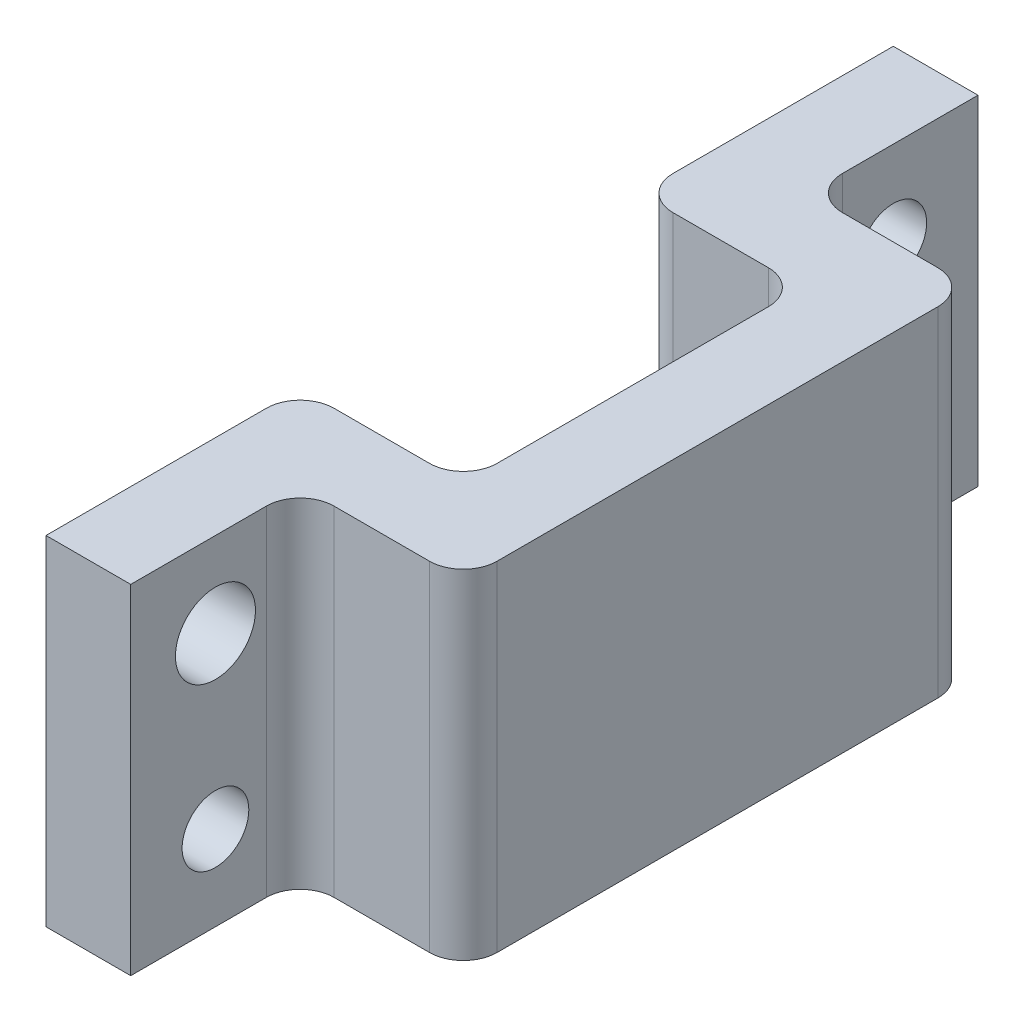
ISO-10303-21;
HEADER;
FILE_DESCRIPTION(('STEP AP214'),'2;1');
FILE_NAME('part.step','',(''),(''),'','','');
FILE_SCHEMA(('AUTOMOTIVE_DESIGN { 1 0 10303 214 1 1 1 1 }'));
ENDSEC;
DATA;
#1=APPLICATION_CONTEXT('core data for automotive mechanical design processes');
#2=APPLICATION_PROTOCOL_DEFINITION('international standard','automotive_design',2000,#1);
#3=PRODUCT_CONTEXT('',#1,'mechanical');
#4=PRODUCT('Part','Part','',(#3));
#5=PRODUCT_RELATED_PRODUCT_CATEGORY('part','',(#4));
#6=PRODUCT_DEFINITION_FORMATION('','',#4);
#7=PRODUCT_DEFINITION_CONTEXT('part definition',#1,'design');
#8=PRODUCT_DEFINITION('design','',#6,#7);
#9=PRODUCT_DEFINITION_SHAPE('','',#8);
#10=(LENGTH_UNIT() NAMED_UNIT(*) SI_UNIT(.MILLI.,.METRE.));
#11=(NAMED_UNIT(*) PLANE_ANGLE_UNIT() SI_UNIT($,.RADIAN.));
#12=(NAMED_UNIT(*) SI_UNIT($,.STERADIAN.) SOLID_ANGLE_UNIT());
#13=UNCERTAINTY_MEASURE_WITH_UNIT(LENGTH_MEASURE(1.E-05),#10,'distance_accuracy_value','');
#14=(GEOMETRIC_REPRESENTATION_CONTEXT(3) GLOBAL_UNCERTAINTY_ASSIGNED_CONTEXT((#13)) GLOBAL_UNIT_ASSIGNED_CONTEXT((#10,
#11,#12)) REPRESENTATION_CONTEXT('',''));
#15=CARTESIAN_POINT('',(0.,0.,0.));
#16=DIRECTION('',(0.,0.,1.));
#17=DIRECTION('',(1.,0.,0.));
#18=AXIS2_PLACEMENT_3D('',#15,#16,#17);
#19=CARTESIAN_POINT('',(0.476250000000005,25.4,-31.75));
#20=DIRECTION('',(0.,0.,1.));
#21=DIRECTION('',(1.,0.,0.));
#22=AXIS2_PLACEMENT_3D('',#19,#20,#21);
#23=PLANE('',#22);
#24=DIRECTION('',(-1.,0.,0.));
#25=VECTOR('',#24,1.);
#26=CARTESIAN_POINT('',(0.476250000000005,0.,-31.75));
#27=LINE('',#26,#25);
#28=CARTESIAN_POINT('',(6.82625,0.,-31.75));
#29=VERTEX_POINT('',#28);
#30=CARTESIAN_POINT('',(0.476250000000005,0.,-31.75));
#31=VERTEX_POINT('',#30);
#32=EDGE_CURVE('E215',#29,#31,#27,.T.);
#33=ORIENTED_EDGE('',*,*,#32,.T.);
#34=DIRECTION('',(0.,-1.,0.));
#35=VECTOR('',#34,1.);
#36=CARTESIAN_POINT('',(0.476250000000005,25.4,-31.75));
#37=LINE('',#36,#35);
#38=CARTESIAN_POINT('',(0.476250000000005,25.4,-31.75));
#39=VERTEX_POINT('',#38);
#40=EDGE_CURVE('E11',#39,#31,#37,.T.);
#41=ORIENTED_EDGE('',*,*,#40,.F.);
#42=DIRECTION('',(-1.,0.,0.));
#43=VECTOR('',#42,1.);
#44=CARTESIAN_POINT('',(0.476250000000005,25.4,-31.75));
#45=LINE('',#44,#43);
#46=CARTESIAN_POINT('',(6.82625,25.4,-31.75));
#47=VERTEX_POINT('',#46);
#48=EDGE_CURVE('E254',#47,#39,#45,.T.);
#49=ORIENTED_EDGE('',*,*,#48,.F.);
#50=DIRECTION('',(0.,-1.,0.));
#51=VECTOR('',#50,1.);
#52=CARTESIAN_POINT('',(6.82625,25.4,-31.75));
#53=LINE('',#52,#51);
#54=EDGE_CURVE('E211',#47,#29,#53,.T.);
#55=ORIENTED_EDGE('',*,*,#54,.T.);
#56=EDGE_LOOP('',(#33,#41,#49,#55));
#57=FACE_BOUND('',#56,.T.);
#58=ADVANCED_FACE('F47',(#57),#23,.F.);
#59=CARTESIAN_POINT('',(0.476250000000005,25.4,-31.75));
#60=DIRECTION('',(1.,0.,0.));
#61=DIRECTION('',(0.,0.,-1.));
#62=AXIS2_PLACEMENT_3D('',#59,#60,#61);
#63=PLANE('',#62);
#64=CARTESIAN_POINT('',(0.476249999999996,19.05,-25.4));
#65=DIRECTION('',(1.,0.,0.));
#66=DIRECTION('',(0.,0.,-1.));
#67=AXIS2_PLACEMENT_3D('',#64,#65,#66);
#68=CIRCLE('',#67,2.5);
#69=CARTESIAN_POINT('',(0.476249999999998,19.05,-27.9));
#70=VERTEX_POINT('',#69);
#71=EDGE_CURVE('E636',#70,#70,#68,.T.);
#72=ORIENTED_EDGE('',*,*,#71,.T.);
#73=EDGE_LOOP('',(#72));
#74=FACE_BOUND('',#73,.T.);
#75=CARTESIAN_POINT('',(0.476250000000005,6.35,-25.4));
#76=DIRECTION('',(1.,0.,0.));
#77=DIRECTION('',(0.,0.,-1.));
#78=AXIS2_PLACEMENT_3D('',#75,#76,#77);
#79=CIRCLE('',#78,2.99999999999999);
#80=CARTESIAN_POINT('',(0.476250000000005,6.35,-28.4));
#81=VERTEX_POINT('',#80);
#82=EDGE_CURVE('E638',#81,#81,#79,.F.);
#83=ORIENTED_EDGE('',*,*,#82,.F.);
#84=EDGE_LOOP('',(#83));
#85=FACE_BOUND('',#84,.T.);
#86=DIRECTION('',(0.,0.,1.));
#87=VECTOR('',#86,1.);
#88=CARTESIAN_POINT('',(0.476250000000005,0.,-31.75));
#89=LINE('',#88,#87);
#90=CARTESIAN_POINT('',(0.476250000000004,0.,-15.24));
#91=VERTEX_POINT('',#90);
#92=EDGE_CURVE('E218',#31,#91,#89,.T.);
#93=ORIENTED_EDGE('',*,*,#92,.T.);
#94=DIRECTION('',(0.,-1.,0.));
#95=VECTOR('',#94,1.);
#96=CARTESIAN_POINT('',(0.476250000000004,25.4,-15.24));
#97=LINE('',#96,#95);
#98=CARTESIAN_POINT('',(0.476250000000004,25.4,-15.24));
#99=VERTEX_POINT('',#98);
#100=EDGE_CURVE('E55',#99,#91,#97,.T.);
#101=ORIENTED_EDGE('',*,*,#100,.F.);
#102=DIRECTION('',(0.,0.,1.));
#103=VECTOR('',#102,1.);
#104=CARTESIAN_POINT('',(0.476250000000005,25.4,-31.75));
#105=LINE('',#104,#103);
#106=EDGE_CURVE('E142',#39,#99,#105,.T.);
#107=ORIENTED_EDGE('',*,*,#106,.F.);
#108=ORIENTED_EDGE('',*,*,#40,.T.);
#109=EDGE_LOOP('',(#93,#101,#107,#108));
#110=FACE_BOUND('',#109,.T.);
#111=ADVANCED_FACE('F377',(#74,#85,#110),#63,.F.);
#112=CARTESIAN_POINT('',(3.01625,25.4,-15.24));
#113=DIRECTION('',(0.,-1.,0.));
#114=DIRECTION('',(0.,0.,-1.));
#115=AXIS2_PLACEMENT_3D('',#112,#113,#114);
#116=CYLINDRICAL_SURFACE('',#115,2.54);
#117=CARTESIAN_POINT('',(3.01625,0.,-15.24));
#118=DIRECTION('',(0.,1.,0.));
#119=DIRECTION('',(0.,0.,1.));
#120=AXIS2_PLACEMENT_3D('',#117,#118,#119);
#121=CIRCLE('',#120,2.54);
#122=CARTESIAN_POINT('',(3.01625,0.,-12.7));
#123=VERTEX_POINT('',#122);
#124=EDGE_CURVE('E221',#91,#123,#121,.T.);
#125=ORIENTED_EDGE('',*,*,#124,.T.);
#126=DIRECTION('',(0.,-1.,0.));
#127=VECTOR('',#126,1.);
#128=CARTESIAN_POINT('',(3.01625,25.4,-12.7));
#129=LINE('',#128,#127);
#130=CARTESIAN_POINT('',(3.01625,25.4,-12.7));
#131=VERTEX_POINT('',#130);
#132=EDGE_CURVE('E297',#131,#123,#129,.T.);
#133=ORIENTED_EDGE('',*,*,#132,.F.);
#134=CARTESIAN_POINT('',(3.01625,25.4,-15.24));
#135=DIRECTION('',(0.,1.,0.));
#136=DIRECTION('',(0.,0.,1.));
#137=AXIS2_PLACEMENT_3D('',#134,#135,#136);
#138=CIRCLE('',#137,2.54);
#139=EDGE_CURVE('E305',#99,#131,#138,.T.);
#140=ORIENTED_EDGE('',*,*,#139,.F.);
#141=ORIENTED_EDGE('',*,*,#100,.T.);
#142=EDGE_LOOP('',(#125,#133,#140,#141));
#143=FACE_BOUND('',#142,.T.);
#144=ADVANCED_FACE('F303',(#143),#116,.T.);
#145=CARTESIAN_POINT('',(3.01625,25.4,-12.7));
#146=DIRECTION('',(0.,0.,-1.));
#147=DIRECTION('',(-1.,0.,0.));
#148=AXIS2_PLACEMENT_3D('',#145,#146,#147);
#149=PLANE('',#148);
#150=DIRECTION('',(1.,0.,0.));
#151=VECTOR('',#150,1.);
#152=CARTESIAN_POINT('',(3.01625,0.,-12.7));
#153=LINE('',#152,#151);
#154=CARTESIAN_POINT('',(10.16,0.,-12.7));
#155=VERTEX_POINT('',#154);
#156=EDGE_CURVE('E223',#123,#155,#153,.T.);
#157=ORIENTED_EDGE('',*,*,#156,.T.);
#158=DIRECTION('',(0.,-1.,0.));
#159=VECTOR('',#158,1.);
#160=CARTESIAN_POINT('',(10.16,25.4,-12.7));
#161=LINE('',#160,#159);
#162=CARTESIAN_POINT('',(10.16,25.4,-12.7));
#163=VERTEX_POINT('',#162);
#164=EDGE_CURVE('E294',#163,#155,#161,.T.);
#165=ORIENTED_EDGE('',*,*,#164,.F.);
#166=DIRECTION('',(1.,0.,0.));
#167=VECTOR('',#166,1.);
#168=CARTESIAN_POINT('',(3.01625,25.4,-12.7));
#169=LINE('',#168,#167);
#170=EDGE_CURVE('E323',#131,#163,#169,.T.);
#171=ORIENTED_EDGE('',*,*,#170,.F.);
#172=ORIENTED_EDGE('',*,*,#132,.T.);
#173=EDGE_LOOP('',(#157,#165,#171,#172));
#174=FACE_BOUND('',#173,.T.);
#175=ADVANCED_FACE('F314',(#174),#149,.F.);
#176=CARTESIAN_POINT('',(10.16,25.4,-10.16));
#177=DIRECTION('',(0.,-1.,0.));
#178=DIRECTION('',(0.,0.,-1.));
#179=AXIS2_PLACEMENT_3D('',#176,#177,#178);
#180=CYLINDRICAL_SURFACE('',#179,2.54);
#181=CARTESIAN_POINT('',(10.16,0.,-10.16));
#182=DIRECTION('',(0.,-1.,0.));
#183=DIRECTION('',(0.,0.,-1.));
#184=AXIS2_PLACEMENT_3D('',#181,#182,#183);
#185=CIRCLE('',#184,2.54);
#186=CARTESIAN_POINT('',(12.7,0.,-10.16));
#187=VERTEX_POINT('',#186);
#188=EDGE_CURVE('E225',#155,#187,#185,.T.);
#189=ORIENTED_EDGE('',*,*,#188,.T.);
#190=DIRECTION('',(0.,-1.,0.));
#191=VECTOR('',#190,1.);
#192=CARTESIAN_POINT('',(12.7,25.4,-10.16));
#193=LINE('',#192,#191);
#194=CARTESIAN_POINT('',(12.7,25.4,-10.16));
#195=VERTEX_POINT('',#194);
#196=EDGE_CURVE('E291',#195,#187,#193,.T.);
#197=ORIENTED_EDGE('',*,*,#196,.F.);
#198=CARTESIAN_POINT('',(10.16,25.4,-10.16));
#199=DIRECTION('',(0.,-1.,0.));
#200=DIRECTION('',(0.,0.,-1.));
#201=AXIS2_PLACEMENT_3D('',#198,#199,#200);
#202=CIRCLE('',#201,2.54);
#203=EDGE_CURVE('E320',#163,#195,#202,.T.);
#204=ORIENTED_EDGE('',*,*,#203,.F.);
#205=ORIENTED_EDGE('',*,*,#164,.T.);
#206=EDGE_LOOP('',(#189,#197,#204,#205));
#207=FACE_BOUND('',#206,.T.);
#208=ADVANCED_FACE('F318',(#207),#180,.F.);
#209=CARTESIAN_POINT('',(12.7,25.4,-10.16));
#210=DIRECTION('',(1.,0.,0.));
#211=DIRECTION('',(0.,0.,-1.));
#212=AXIS2_PLACEMENT_3D('',#209,#210,#211);
#213=PLANE('',#212);
#214=DIRECTION('',(0.,0.,1.));
#215=VECTOR('',#214,1.);
#216=CARTESIAN_POINT('',(12.7,0.,-10.16));
#217=LINE('',#216,#215);
#218=CARTESIAN_POINT('',(12.7,0.,10.16));
#219=VERTEX_POINT('',#218);
#220=EDGE_CURVE('E227',#187,#219,#217,.T.);
#221=ORIENTED_EDGE('',*,*,#220,.T.);
#222=DIRECTION('',(0.,-1.,0.));
#223=VECTOR('',#222,1.);
#224=CARTESIAN_POINT('',(12.7,25.4,10.16));
#225=LINE('',#224,#223);
#226=CARTESIAN_POINT('',(12.7,25.4,10.16));
#227=VERTEX_POINT('',#226);
#228=EDGE_CURVE('E288',#227,#219,#225,.T.);
#229=ORIENTED_EDGE('',*,*,#228,.F.);
#230=DIRECTION('',(0.,0.,1.));
#231=VECTOR('',#230,1.);
#232=CARTESIAN_POINT('',(12.7,25.4,-10.16));
#233=LINE('',#232,#231);
#234=EDGE_CURVE('E322',#195,#227,#233,.T.);
#235=ORIENTED_EDGE('',*,*,#234,.F.);
#236=ORIENTED_EDGE('',*,*,#196,.T.);
#237=EDGE_LOOP('',(#221,#229,#235,#236));
#238=FACE_BOUND('',#237,.T.);
#239=ADVANCED_FACE('F395',(#238),#213,.F.);
#240=CARTESIAN_POINT('',(10.16,25.4,10.16));
#241=DIRECTION('',(0.,-1.,0.));
#242=DIRECTION('',(0.,0.,-1.));
#243=AXIS2_PLACEMENT_3D('',#240,#241,#242);
#244=CYLINDRICAL_SURFACE('',#243,2.54);
#245=CARTESIAN_POINT('',(10.16,0.,10.16));
#246=DIRECTION('',(0.,-1.,0.));
#247=DIRECTION('',(0.,0.,-1.));
#248=AXIS2_PLACEMENT_3D('',#245,#246,#247);
#249=CIRCLE('',#248,2.54);
#250=CARTESIAN_POINT('',(10.16,0.,12.7));
#251=VERTEX_POINT('',#250);
#252=EDGE_CURVE('E229',#219,#251,#249,.T.);
#253=ORIENTED_EDGE('',*,*,#252,.T.);
#254=DIRECTION('',(0.,-1.,0.));
#255=VECTOR('',#254,1.);
#256=CARTESIAN_POINT('',(10.16,25.4,12.7));
#257=LINE('',#256,#255);
#258=CARTESIAN_POINT('',(10.16,25.4,12.7));
#259=VERTEX_POINT('',#258);
#260=EDGE_CURVE('E285',#259,#251,#257,.T.);
#261=ORIENTED_EDGE('',*,*,#260,.F.);
#262=CARTESIAN_POINT('',(10.16,25.4,10.16));
#263=DIRECTION('',(0.,-1.,0.));
#264=DIRECTION('',(0.,0.,-1.));
#265=AXIS2_PLACEMENT_3D('',#262,#263,#264);
#266=CIRCLE('',#265,2.54);
#267=EDGE_CURVE('E325',#227,#259,#266,.T.);
#268=ORIENTED_EDGE('',*,*,#267,.F.);
#269=ORIENTED_EDGE('',*,*,#228,.T.);
#270=EDGE_LOOP('',(#253,#261,#268,#269));
#271=FACE_BOUND('',#270,.T.);
#272=ADVANCED_FACE('F398',(#271),#244,.F.);
#273=CARTESIAN_POINT('',(10.16,25.4,12.7));
#274=DIRECTION('',(0.,0.,1.));
#275=DIRECTION('',(1.,0.,0.));
#276=AXIS2_PLACEMENT_3D('',#273,#274,#275);
#277=PLANE('',#276);
#278=DIRECTION('',(-1.,0.,0.));
#279=VECTOR('',#278,1.);
#280=CARTESIAN_POINT('',(10.16,0.,12.7));
#281=LINE('',#280,#279);
#282=CARTESIAN_POINT('',(3.01625,0.,12.7));
#283=VERTEX_POINT('',#282);
#284=EDGE_CURVE('E231',#251,#283,#281,.T.);
#285=ORIENTED_EDGE('',*,*,#284,.T.);
#286=DIRECTION('',(0.,-1.,0.));
#287=VECTOR('',#286,1.);
#288=CARTESIAN_POINT('',(3.01625,25.4,12.7));
#289=LINE('',#288,#287);
#290=CARTESIAN_POINT('',(3.01625,25.4,12.7));
#291=VERTEX_POINT('',#290);
#292=EDGE_CURVE('E282',#291,#283,#289,.T.);
#293=ORIENTED_EDGE('',*,*,#292,.F.);
#294=DIRECTION('',(-1.,0.,0.));
#295=VECTOR('',#294,1.);
#296=CARTESIAN_POINT('',(10.16,25.4,12.7));
#297=LINE('',#296,#295);
#298=EDGE_CURVE('E331',#259,#291,#297,.T.);
#299=ORIENTED_EDGE('',*,*,#298,.F.);
#300=ORIENTED_EDGE('',*,*,#260,.T.);
#301=EDGE_LOOP('',(#285,#293,#299,#300));
#302=FACE_BOUND('',#301,.T.);
#303=ADVANCED_FACE('F402',(#302),#277,.F.);
#304=CARTESIAN_POINT('',(3.01625,25.4,15.24));
#305=DIRECTION('',(0.,-1.,0.));
#306=DIRECTION('',(0.,0.,-1.));
#307=AXIS2_PLACEMENT_3D('',#304,#305,#306);
#308=CYLINDRICAL_SURFACE('',#307,2.54);
#309=CARTESIAN_POINT('',(3.01625,0.,15.24));
#310=DIRECTION('',(0.,1.,0.));
#311=DIRECTION('',(0.,0.,1.));
#312=AXIS2_PLACEMENT_3D('',#309,#310,#311);
#313=CIRCLE('',#312,2.54);
#314=CARTESIAN_POINT('',(0.476250000000003,0.,15.24));
#315=VERTEX_POINT('',#314);
#316=EDGE_CURVE('E233',#283,#315,#313,.T.);
#317=ORIENTED_EDGE('',*,*,#316,.T.);
#318=DIRECTION('',(0.,-1.,0.));
#319=VECTOR('',#318,1.);
#320=CARTESIAN_POINT('',(0.476250000000003,25.4,15.24));
#321=LINE('',#320,#319);
#322=CARTESIAN_POINT('',(0.476250000000003,25.4,15.24));
#323=VERTEX_POINT('',#322);
#324=EDGE_CURVE('E279',#323,#315,#321,.T.);
#325=ORIENTED_EDGE('',*,*,#324,.F.);
#326=CARTESIAN_POINT('',(3.01625,25.4,15.24));
#327=DIRECTION('',(0.,1.,0.));
#328=DIRECTION('',(0.,0.,1.));
#329=AXIS2_PLACEMENT_3D('',#326,#327,#328);
#330=CIRCLE('',#329,2.54);
#331=EDGE_CURVE('E333',#291,#323,#330,.T.);
#332=ORIENTED_EDGE('',*,*,#331,.F.);
#333=ORIENTED_EDGE('',*,*,#292,.T.);
#334=EDGE_LOOP('',(#317,#325,#332,#333));
#335=FACE_BOUND('',#334,.T.);
#336=ADVANCED_FACE('F406',(#335),#308,.T.);
#337=CARTESIAN_POINT('',(0.476250000000004,25.4,15.24));
#338=DIRECTION('',(1.,0.,0.));
#339=DIRECTION('',(0.,0.,-1.));
#340=AXIS2_PLACEMENT_3D('',#337,#338,#339);
#341=PLANE('',#340);
#342=CARTESIAN_POINT('',(0.476249999999954,6.35,25.4));
#343=DIRECTION('',(1.,0.,0.));
#344=DIRECTION('',(0.,0.,-1.));
#345=AXIS2_PLACEMENT_3D('',#342,#343,#344);
#346=CIRCLE('',#345,2.5);
#347=CARTESIAN_POINT('',(0.476249999999956,6.35,22.9));
#348=VERTEX_POINT('',#347);
#349=EDGE_CURVE('E626',#348,#348,#346,.T.);
#350=ORIENTED_EDGE('',*,*,#349,.T.);
#351=EDGE_LOOP('',(#350));
#352=FACE_BOUND('',#351,.T.);
#353=CARTESIAN_POINT('',(0.476250000000005,19.05,25.4));
#354=DIRECTION('',(1.,0.,0.));
#355=DIRECTION('',(0.,0.,-1.));
#356=AXIS2_PLACEMENT_3D('',#353,#354,#355);
#357=CIRCLE('',#356,2.99999999999999);
#358=CARTESIAN_POINT('',(0.476250000000004,19.05,22.4));
#359=VERTEX_POINT('',#358);
#360=EDGE_CURVE('E219',#359,#359,#357,.F.);
#361=ORIENTED_EDGE('',*,*,#360,.F.);
#362=EDGE_LOOP('',(#361));
#363=FACE_BOUND('',#362,.T.);
#364=DIRECTION('',(0.,0.,1.));
#365=VECTOR('',#364,1.);
#366=CARTESIAN_POINT('',(0.476250000000004,0.,15.24));
#367=LINE('',#366,#365);
#368=CARTESIAN_POINT('',(0.476250000000005,0.,31.75));
#369=VERTEX_POINT('',#368);
#370=EDGE_CURVE('E235',#315,#369,#367,.T.);
#371=ORIENTED_EDGE('',*,*,#370,.T.);
#372=DIRECTION('',(0.,-1.,0.));
#373=VECTOR('',#372,1.);
#374=CARTESIAN_POINT('',(0.476250000000005,25.4,31.75));
#375=LINE('',#374,#373);
#376=CARTESIAN_POINT('',(0.476250000000005,25.4,31.75));
#377=VERTEX_POINT('',#376);
#378=EDGE_CURVE('E276',#377,#369,#375,.T.);
#379=ORIENTED_EDGE('',*,*,#378,.F.);
#380=DIRECTION('',(0.,0.,1.));
#381=VECTOR('',#380,1.);
#382=CARTESIAN_POINT('',(0.476250000000004,25.4,15.24));
#383=LINE('',#382,#381);
#384=EDGE_CURVE('E335',#323,#377,#383,.T.);
#385=ORIENTED_EDGE('',*,*,#384,.F.);
#386=ORIENTED_EDGE('',*,*,#324,.T.);
#387=EDGE_LOOP('',(#371,#379,#385,#386));
#388=FACE_BOUND('',#387,.T.);
#389=ADVANCED_FACE('F410',(#352,#363,#388),#341,.F.);
#390=CARTESIAN_POINT('',(6.82625000000001,25.4,31.75));
#391=DIRECTION('',(0.,0.,-1.));
#392=DIRECTION('',(-1.,0.,0.));
#393=AXIS2_PLACEMENT_3D('',#390,#391,#392);
#394=PLANE('',#393);
#395=DIRECTION('',(1.,0.,0.));
#396=VECTOR('',#395,1.);
#397=CARTESIAN_POINT('',(6.82625000000001,0.,31.75));
#398=LINE('',#397,#396);
#399=CARTESIAN_POINT('',(6.82625000000001,0.,31.75));
#400=VERTEX_POINT('',#399);
#401=EDGE_CURVE('E237',#369,#400,#398,.T.);
#402=ORIENTED_EDGE('',*,*,#401,.T.);
#403=DIRECTION('',(0.,-1.,0.));
#404=VECTOR('',#403,1.);
#405=CARTESIAN_POINT('',(6.82625000000001,25.4,31.75));
#406=LINE('',#405,#404);
#407=CARTESIAN_POINT('',(6.82625000000001,25.4,31.75));
#408=VERTEX_POINT('',#407);
#409=EDGE_CURVE('E273',#408,#400,#406,.T.);
#410=ORIENTED_EDGE('',*,*,#409,.F.);
#411=DIRECTION('',(1.,0.,0.));
#412=VECTOR('',#411,1.);
#413=CARTESIAN_POINT('',(6.82625000000001,25.4,31.75));
#414=LINE('',#413,#412);
#415=EDGE_CURVE('E337',#377,#408,#414,.T.);
#416=ORIENTED_EDGE('',*,*,#415,.F.);
#417=ORIENTED_EDGE('',*,*,#378,.T.);
#418=EDGE_LOOP('',(#402,#410,#416,#417));
#419=FACE_BOUND('',#418,.T.);
#420=ADVANCED_FACE('F413',(#419),#394,.F.);
#421=CARTESIAN_POINT('',(6.82625000000001,25.4,21.59));
#422=DIRECTION('',(-1.,0.,0.));
#423=DIRECTION('',(0.,0.,1.));
#424=AXIS2_PLACEMENT_3D('',#421,#422,#423);
#425=PLANE('',#424);
#426=CARTESIAN_POINT('',(6.82625000000001,6.35,25.4));
#427=DIRECTION('',(1.,0.,0.));
#428=DIRECTION('',(0.,0.,-1.));
#429=AXIS2_PLACEMENT_3D('',#426,#427,#428);
#430=CIRCLE('',#429,2.5);
#431=CARTESIAN_POINT('',(6.82625000000001,6.35,22.9));
#432=VERTEX_POINT('',#431);
#433=EDGE_CURVE('E629',#432,#432,#430,.T.);
#434=ORIENTED_EDGE('',*,*,#433,.F.);
#435=EDGE_LOOP('',(#434));
#436=FACE_BOUND('',#435,.T.);
#437=CARTESIAN_POINT('',(6.82625000000006,19.05,25.4));
#438=DIRECTION('',(1.,0.,0.));
#439=DIRECTION('',(0.,0.,-1.));
#440=AXIS2_PLACEMENT_3D('',#437,#438,#439);
#441=CIRCLE('',#440,2.99999999999999);
#442=CARTESIAN_POINT('',(6.82625000000006,19.05,22.4));
#443=VERTEX_POINT('',#442);
#444=EDGE_CURVE('E639',#443,#443,#441,.T.);
#445=ORIENTED_EDGE('',*,*,#444,.F.);
#446=EDGE_LOOP('',(#445));
#447=FACE_BOUND('',#446,.T.);
#448=DIRECTION('',(0.,0.,-1.));
#449=VECTOR('',#448,1.);
#450=CARTESIAN_POINT('',(6.82625000000001,0.,21.59));
#451=LINE('',#450,#449);
#452=CARTESIAN_POINT('',(6.82625000000001,0.,21.59));
#453=VERTEX_POINT('',#452);
#454=EDGE_CURVE('E239',#400,#453,#451,.T.);
#455=ORIENTED_EDGE('',*,*,#454,.T.);
#456=DIRECTION('',(0.,-1.,0.));
#457=VECTOR('',#456,1.);
#458=CARTESIAN_POINT('',(6.82625000000001,25.4,21.59));
#459=LINE('',#458,#457);
#460=CARTESIAN_POINT('',(6.82625000000001,25.4,21.59));
#461=VERTEX_POINT('',#460);
#462=EDGE_CURVE('E270',#461,#453,#459,.T.);
#463=ORIENTED_EDGE('',*,*,#462,.F.);
#464=DIRECTION('',(0.,0.,-1.));
#465=VECTOR('',#464,1.);
#466=CARTESIAN_POINT('',(6.82625000000001,25.4,21.59));
#467=LINE('',#466,#465);
#468=EDGE_CURVE('E339',#408,#461,#467,.T.);
#469=ORIENTED_EDGE('',*,*,#468,.F.);
#470=ORIENTED_EDGE('',*,*,#409,.T.);
#471=EDGE_LOOP('',(#455,#463,#469,#470));
#472=FACE_BOUND('',#471,.T.);
#473=ADVANCED_FACE('F417',(#436,#447,#472),#425,.F.);
#474=CARTESIAN_POINT('',(9.36625000000001,25.4,21.59));
#475=DIRECTION('',(0.,-1.,0.));
#476=DIRECTION('',(0.,0.,-1.));
#477=AXIS2_PLACEMENT_3D('',#474,#475,#476);
#478=CYLINDRICAL_SURFACE('',#477,2.54);
#479=CARTESIAN_POINT('',(9.36625000000001,0.,21.59));
#480=DIRECTION('',(0.,-1.,0.));
#481=DIRECTION('',(0.,0.,1.));
#482=AXIS2_PLACEMENT_3D('',#479,#480,#481);
#483=CIRCLE('',#482,2.54);
#484=CARTESIAN_POINT('',(9.36625000000001,0.,19.05));
#485=VERTEX_POINT('',#484);
#486=EDGE_CURVE('E241',#453,#485,#483,.T.);
#487=ORIENTED_EDGE('',*,*,#486,.T.);
#488=DIRECTION('',(0.,-1.,0.));
#489=VECTOR('',#488,1.);
#490=CARTESIAN_POINT('',(9.36625000000001,25.4,19.05));
#491=LINE('',#490,#489);
#492=CARTESIAN_POINT('',(9.36625000000001,25.4,19.05));
#493=VERTEX_POINT('',#492);
#494=EDGE_CURVE('E267',#493,#485,#491,.T.);
#495=ORIENTED_EDGE('',*,*,#494,.F.);
#496=CARTESIAN_POINT('',(9.36625000000001,25.4,21.59));
#497=DIRECTION('',(0.,-1.,0.));
#498=DIRECTION('',(0.,0.,1.));
#499=AXIS2_PLACEMENT_3D('',#496,#497,#498);
#500=CIRCLE('',#499,2.54);
#501=EDGE_CURVE('E341',#461,#493,#500,.T.);
#502=ORIENTED_EDGE('',*,*,#501,.F.);
#503=ORIENTED_EDGE('',*,*,#462,.T.);
#504=EDGE_LOOP('',(#487,#495,#502,#503));
#505=FACE_BOUND('',#504,.T.);
#506=ADVANCED_FACE('F421',(#505),#478,.F.);
#507=CARTESIAN_POINT('',(16.51,25.4,19.05));
#508=DIRECTION('',(0.,0.,-1.));
#509=DIRECTION('',(-1.,0.,0.));
#510=AXIS2_PLACEMENT_3D('',#507,#508,#509);
#511=PLANE('',#510);
#512=DIRECTION('',(1.,0.,0.));
#513=VECTOR('',#512,1.);
#514=CARTESIAN_POINT('',(16.51,0.,19.05));
#515=LINE('',#514,#513);
#516=CARTESIAN_POINT('',(16.51,0.,19.05));
#517=VERTEX_POINT('',#516);
#518=EDGE_CURVE('E243',#485,#517,#515,.T.);
#519=ORIENTED_EDGE('',*,*,#518,.T.);
#520=DIRECTION('',(0.,-1.,0.));
#521=VECTOR('',#520,1.);
#522=CARTESIAN_POINT('',(16.51,25.4,19.05));
#523=LINE('',#522,#521);
#524=CARTESIAN_POINT('',(16.51,25.4,19.05));
#525=VERTEX_POINT('',#524);
#526=EDGE_CURVE('E264',#525,#517,#523,.T.);
#527=ORIENTED_EDGE('',*,*,#526,.F.);
#528=DIRECTION('',(1.,0.,0.));
#529=VECTOR('',#528,1.);
#530=CARTESIAN_POINT('',(16.51,25.4,19.05));
#531=LINE('',#530,#529);
#532=EDGE_CURVE('E343',#493,#525,#531,.T.);
#533=ORIENTED_EDGE('',*,*,#532,.F.);
#534=ORIENTED_EDGE('',*,*,#494,.T.);
#535=EDGE_LOOP('',(#519,#527,#533,#534));
#536=FACE_BOUND('',#535,.T.);
#537=ADVANCED_FACE('F425',(#536),#511,.F.);
#538=CARTESIAN_POINT('',(16.51,25.4,16.51));
#539=DIRECTION('',(0.,-1.,0.));
#540=DIRECTION('',(0.,0.,-1.));
#541=AXIS2_PLACEMENT_3D('',#538,#539,#540);
#542=CYLINDRICAL_SURFACE('',#541,2.54);
#543=CARTESIAN_POINT('',(16.51,0.,16.51));
#544=DIRECTION('',(0.,1.,0.));
#545=DIRECTION('',(0.,0.,-1.));
#546=AXIS2_PLACEMENT_3D('',#543,#544,#545);
#547=CIRCLE('',#546,2.54);
#548=CARTESIAN_POINT('',(19.05,0.,16.51));
#549=VERTEX_POINT('',#548);
#550=EDGE_CURVE('E245',#517,#549,#547,.T.);
#551=ORIENTED_EDGE('',*,*,#550,.T.);
#552=DIRECTION('',(0.,-1.,0.));
#553=VECTOR('',#552,1.);
#554=CARTESIAN_POINT('',(19.05,25.4,16.51));
#555=LINE('',#554,#553);
#556=CARTESIAN_POINT('',(19.05,25.4,16.51));
#557=VERTEX_POINT('',#556);
#558=EDGE_CURVE('E261',#557,#549,#555,.T.);
#559=ORIENTED_EDGE('',*,*,#558,.F.);
#560=CARTESIAN_POINT('',(16.51,25.4,16.51));
#561=DIRECTION('',(0.,1.,0.));
#562=DIRECTION('',(0.,0.,-1.));
#563=AXIS2_PLACEMENT_3D('',#560,#561,#562);
#564=CIRCLE('',#563,2.54);
#565=EDGE_CURVE('E345',#525,#557,#564,.T.);
#566=ORIENTED_EDGE('',*,*,#565,.F.);
#567=ORIENTED_EDGE('',*,*,#526,.T.);
#568=EDGE_LOOP('',(#551,#559,#566,#567));
#569=FACE_BOUND('',#568,.T.);
#570=ADVANCED_FACE('F429',(#569),#542,.T.);
#571=CARTESIAN_POINT('',(19.05,25.4,-16.51));
#572=DIRECTION('',(-1.,0.,0.));
#573=DIRECTION('',(0.,0.,1.));
#574=AXIS2_PLACEMENT_3D('',#571,#572,#573);
#575=PLANE('',#574);
#576=DIRECTION('',(0.,0.,-1.));
#577=VECTOR('',#576,1.);
#578=CARTESIAN_POINT('',(19.05,0.,-16.51));
#579=LINE('',#578,#577);
#580=CARTESIAN_POINT('',(19.05,0.,-16.51));
#581=VERTEX_POINT('',#580);
#582=EDGE_CURVE('E247',#549,#581,#579,.T.);
#583=ORIENTED_EDGE('',*,*,#582,.T.);
#584=DIRECTION('',(0.,-1.,0.));
#585=VECTOR('',#584,1.);
#586=CARTESIAN_POINT('',(19.05,25.4,-16.51));
#587=LINE('',#586,#585);
#588=CARTESIAN_POINT('',(19.05,25.4,-16.51));
#589=VERTEX_POINT('',#588);
#590=EDGE_CURVE('E258',#589,#581,#587,.T.);
#591=ORIENTED_EDGE('',*,*,#590,.F.);
#592=DIRECTION('',(0.,0.,-1.));
#593=VECTOR('',#592,1.);
#594=CARTESIAN_POINT('',(19.05,25.4,-16.51));
#595=LINE('',#594,#593);
#596=EDGE_CURVE('E347',#557,#589,#595,.T.);
#597=ORIENTED_EDGE('',*,*,#596,.F.);
#598=ORIENTED_EDGE('',*,*,#558,.T.);
#599=EDGE_LOOP('',(#583,#591,#597,#598));
#600=FACE_BOUND('',#599,.T.);
#601=ADVANCED_FACE('F353',(#600),#575,.F.);
#602=CARTESIAN_POINT('',(16.51,25.4,-16.51));
#603=DIRECTION('',(0.,-1.,0.));
#604=DIRECTION('',(0.,0.,-1.));
#605=AXIS2_PLACEMENT_3D('',#602,#603,#604);
#606=CYLINDRICAL_SURFACE('',#605,2.54);
#607=CARTESIAN_POINT('',(16.51,0.,-16.51));
#608=DIRECTION('',(0.,1.,0.));
#609=DIRECTION('',(0.,0.,-1.));
#610=AXIS2_PLACEMENT_3D('',#607,#608,#609);
#611=CIRCLE('',#610,2.54);
#612=CARTESIAN_POINT('',(16.51,0.,-19.05));
#613=VERTEX_POINT('',#612);
#614=EDGE_CURVE('E249',#581,#613,#611,.T.);
#615=ORIENTED_EDGE('',*,*,#614,.T.);
#616=DIRECTION('',(0.,-1.,0.));
#617=VECTOR('',#616,1.);
#618=CARTESIAN_POINT('',(16.51,25.4,-19.05));
#619=LINE('',#618,#617);
#620=CARTESIAN_POINT('',(16.51,25.4,-19.05));
#621=VERTEX_POINT('',#620);
#622=EDGE_CURVE('E206',#621,#613,#619,.T.);
#623=ORIENTED_EDGE('',*,*,#622,.F.);
#624=CARTESIAN_POINT('',(16.51,25.4,-16.51));
#625=DIRECTION('',(0.,1.,0.));
#626=DIRECTION('',(0.,0.,-1.));
#627=AXIS2_PLACEMENT_3D('',#624,#625,#626);
#628=CIRCLE('',#627,2.54);
#629=EDGE_CURVE('E197',#589,#621,#628,.T.);
#630=ORIENTED_EDGE('',*,*,#629,.F.);
#631=ORIENTED_EDGE('',*,*,#590,.T.);
#632=EDGE_LOOP('',(#615,#623,#630,#631));
#633=FACE_BOUND('',#632,.T.);
#634=ADVANCED_FACE('F357',(#633),#606,.T.);
#635=CARTESIAN_POINT('',(9.36625000000001,25.4,-19.05));
#636=DIRECTION('',(0.,0.,1.));
#637=DIRECTION('',(1.,0.,0.));
#638=AXIS2_PLACEMENT_3D('',#635,#636,#637);
#639=PLANE('',#638);
#640=DIRECTION('',(-1.,0.,0.));
#641=VECTOR('',#640,1.);
#642=CARTESIAN_POINT('',(9.36625000000001,0.,-19.05));
#643=LINE('',#642,#641);
#644=CARTESIAN_POINT('',(9.36625000000001,0.,-19.05));
#645=VERTEX_POINT('',#644);
#646=EDGE_CURVE('E205',#613,#645,#643,.T.);
#647=ORIENTED_EDGE('',*,*,#646,.T.);
#648=DIRECTION('',(0.,-1.,0.));
#649=VECTOR('',#648,1.);
#650=CARTESIAN_POINT('',(9.36625000000001,25.4,-19.05));
#651=LINE('',#650,#649);
#652=CARTESIAN_POINT('',(9.36625000000001,25.4,-19.05));
#653=VERTEX_POINT('',#652);
#654=EDGE_CURVE('E202',#653,#645,#651,.T.);
#655=ORIENTED_EDGE('',*,*,#654,.F.);
#656=DIRECTION('',(-1.,0.,0.));
#657=VECTOR('',#656,1.);
#658=CARTESIAN_POINT('',(9.36625000000001,25.4,-19.05));
#659=LINE('',#658,#657);
#660=EDGE_CURVE('E191',#621,#653,#659,.T.);
#661=ORIENTED_EDGE('',*,*,#660,.F.);
#662=ORIENTED_EDGE('',*,*,#622,.T.);
#663=EDGE_LOOP('',(#647,#655,#661,#662));
#664=FACE_BOUND('',#663,.T.);
#665=ADVANCED_FACE('F203',(#664),#639,.F.);
#666=CARTESIAN_POINT('',(9.36625000000001,25.4,-21.59));
#667=DIRECTION('',(0.,-1.,0.));
#668=DIRECTION('',(0.,0.,-1.));
#669=AXIS2_PLACEMENT_3D('',#666,#667,#668);
#670=CYLINDRICAL_SURFACE('',#669,2.54);
#671=CARTESIAN_POINT('',(9.36625000000001,0.,-21.59));
#672=DIRECTION('',(0.,-1.,0.));
#673=DIRECTION('',(0.,0.,1.));
#674=AXIS2_PLACEMENT_3D('',#671,#672,#673);
#675=CIRCLE('',#674,2.54);
#676=CARTESIAN_POINT('',(6.82625000000001,0.,-21.59));
#677=VERTEX_POINT('',#676);
#678=EDGE_CURVE('E128',#645,#677,#675,.T.);
#679=ORIENTED_EDGE('',*,*,#678,.T.);
#680=DIRECTION('',(0.,-1.,0.));
#681=VECTOR('',#680,1.);
#682=CARTESIAN_POINT('',(6.82625000000001,25.4,-21.59));
#683=LINE('',#682,#681);
#684=CARTESIAN_POINT('',(6.82625000000001,25.4,-21.59));
#685=VERTEX_POINT('',#684);
#686=EDGE_CURVE('E207',#685,#677,#683,.T.);
#687=ORIENTED_EDGE('',*,*,#686,.F.);
#688=CARTESIAN_POINT('',(9.36625000000001,25.4,-21.59));
#689=DIRECTION('',(0.,-1.,0.));
#690=DIRECTION('',(0.,0.,1.));
#691=AXIS2_PLACEMENT_3D('',#688,#689,#690);
#692=CIRCLE('',#691,2.54);
#693=EDGE_CURVE('E195',#653,#685,#692,.T.);
#694=ORIENTED_EDGE('',*,*,#693,.F.);
#695=ORIENTED_EDGE('',*,*,#654,.T.);
#696=EDGE_LOOP('',(#679,#687,#694,#695));
#697=FACE_BOUND('',#696,.T.);
#698=ADVANCED_FACE('F209',(#697),#670,.F.);
#699=CARTESIAN_POINT('',(6.82625,25.4,-31.75));
#700=DIRECTION('',(-1.,0.,0.));
#701=DIRECTION('',(0.,0.,1.));
#702=AXIS2_PLACEMENT_3D('',#699,#700,#701);
#703=PLANE('',#702);
#704=CARTESIAN_POINT('',(6.82625000000005,19.05,-25.4));
#705=DIRECTION('',(1.,0.,0.));
#706=DIRECTION('',(0.,0.,-1.));
#707=AXIS2_PLACEMENT_3D('',#704,#705,#706);
#708=CIRCLE('',#707,2.5);
#709=CARTESIAN_POINT('',(6.82625000000005,19.05,-27.9));
#710=VERTEX_POINT('',#709);
#711=EDGE_CURVE('E631',#710,#710,#708,.T.);
#712=ORIENTED_EDGE('',*,*,#711,.F.);
#713=EDGE_LOOP('',(#712));
#714=FACE_BOUND('',#713,.T.);
#715=CARTESIAN_POINT('',(6.82625,6.35,-25.4));
#716=DIRECTION('',(1.,0.,0.));
#717=DIRECTION('',(0.,0.,-1.));
#718=AXIS2_PLACEMENT_3D('',#715,#716,#717);
#719=CIRCLE('',#718,2.99999999999999);
#720=CARTESIAN_POINT('',(6.82624999999999,6.35,-28.4));
#721=VERTEX_POINT('',#720);
#722=EDGE_CURVE('E642',#721,#721,#719,.T.);
#723=ORIENTED_EDGE('',*,*,#722,.F.);
#724=EDGE_LOOP('',(#723));
#725=FACE_BOUND('',#724,.T.);
#726=DIRECTION('',(0.,0.,-1.));
#727=VECTOR('',#726,1.);
#728=CARTESIAN_POINT('',(6.82625,0.,-31.75));
#729=LINE('',#728,#727);
#730=EDGE_CURVE('E134',#677,#29,#729,.T.);
#731=ORIENTED_EDGE('',*,*,#730,.T.);
#732=ORIENTED_EDGE('',*,*,#54,.F.);
#733=DIRECTION('',(0.,0.,-1.));
#734=VECTOR('',#733,1.);
#735=CARTESIAN_POINT('',(6.82625,25.4,-31.75));
#736=LINE('',#735,#734);
#737=EDGE_CURVE('E63',#685,#47,#736,.T.);
#738=ORIENTED_EDGE('',*,*,#737,.F.);
#739=ORIENTED_EDGE('',*,*,#686,.T.);
#740=EDGE_LOOP('',(#731,#732,#738,#739));
#741=FACE_BOUND('',#740,.T.);
#742=ADVANCED_FACE('F361',(#714,#725,#741),#703,.F.);
#743=CARTESIAN_POINT('',(9.36625000000001,25.4,-21.59));
#744=DIRECTION('',(0.,1.,0.));
#745=DIRECTION('',(0.,0.,1.));
#746=AXIS2_PLACEMENT_3D('',#743,#744,#745);
#747=PLANE('',#746);
#748=ORIENTED_EDGE('',*,*,#48,.T.);
#749=ORIENTED_EDGE('',*,*,#106,.T.);
#750=ORIENTED_EDGE('',*,*,#139,.T.);
#751=ORIENTED_EDGE('',*,*,#170,.T.);
#752=ORIENTED_EDGE('',*,*,#203,.T.);
#753=ORIENTED_EDGE('',*,*,#234,.T.);
#754=ORIENTED_EDGE('',*,*,#267,.T.);
#755=ORIENTED_EDGE('',*,*,#298,.T.);
#756=ORIENTED_EDGE('',*,*,#331,.T.);
#757=ORIENTED_EDGE('',*,*,#384,.T.);
#758=ORIENTED_EDGE('',*,*,#415,.T.);
#759=ORIENTED_EDGE('',*,*,#468,.T.);
#760=ORIENTED_EDGE('',*,*,#501,.T.);
#761=ORIENTED_EDGE('',*,*,#532,.T.);
#762=ORIENTED_EDGE('',*,*,#565,.T.);
#763=ORIENTED_EDGE('',*,*,#596,.T.);
#764=ORIENTED_EDGE('',*,*,#629,.T.);
#765=ORIENTED_EDGE('',*,*,#660,.T.);
#766=ORIENTED_EDGE('',*,*,#693,.T.);
#767=ORIENTED_EDGE('',*,*,#737,.T.);
#768=EDGE_LOOP('',(#748,#749,#750,#751,#752,#753,#754,#755,#756,#757,#758,#759,#760,#761,#762,
#763,#764,#765,#766,#767));
#769=FACE_BOUND('',#768,.T.);
#770=ADVANCED_FACE('F193',(#769),#747,.T.);
#771=CARTESIAN_POINT('',(9.36625000000001,0.,-21.59));
#772=DIRECTION('',(0.,1.,0.));
#773=DIRECTION('',(0.,0.,1.));
#774=AXIS2_PLACEMENT_3D('',#771,#772,#773);
#775=PLANE('',#774);
#776=ORIENTED_EDGE('',*,*,#32,.F.);
#777=ORIENTED_EDGE('',*,*,#730,.F.);
#778=ORIENTED_EDGE('',*,*,#678,.F.);
#779=ORIENTED_EDGE('',*,*,#646,.F.);
#780=ORIENTED_EDGE('',*,*,#614,.F.);
#781=ORIENTED_EDGE('',*,*,#582,.F.);
#782=ORIENTED_EDGE('',*,*,#550,.F.);
#783=ORIENTED_EDGE('',*,*,#518,.F.);
#784=ORIENTED_EDGE('',*,*,#486,.F.);
#785=ORIENTED_EDGE('',*,*,#454,.F.);
#786=ORIENTED_EDGE('',*,*,#401,.F.);
#787=ORIENTED_EDGE('',*,*,#370,.F.);
#788=ORIENTED_EDGE('',*,*,#316,.F.);
#789=ORIENTED_EDGE('',*,*,#284,.F.);
#790=ORIENTED_EDGE('',*,*,#252,.F.);
#791=ORIENTED_EDGE('',*,*,#220,.F.);
#792=ORIENTED_EDGE('',*,*,#188,.F.);
#793=ORIENTED_EDGE('',*,*,#156,.F.);
#794=ORIENTED_EDGE('',*,*,#124,.F.);
#795=ORIENTED_EDGE('',*,*,#92,.F.);
#796=EDGE_LOOP('',(#776,#777,#778,#779,#780,#781,#782,#783,#784,#785,#786,#787,#788,#789,#790,
#791,#792,#793,#794,#795));
#797=FACE_BOUND('',#796,.T.);
#798=ADVANCED_FACE('F309',(#797),#775,.F.);
#799=CARTESIAN_POINT('',(0.475249999999931,6.35,-25.4));
#800=DIRECTION('',(1.,0.,0.));
#801=DIRECTION('',(0.,0.,-1.));
#802=AXIS2_PLACEMENT_3D('',#799,#800,#801);
#803=CYLINDRICAL_SURFACE('',#802,2.99999999999999);
#804=ORIENTED_EDGE('',*,*,#722,.T.);
#805=EDGE_LOOP('',(#804));
#806=FACE_BOUND('',#805,.T.);
#807=ORIENTED_EDGE('',*,*,#82,.T.);
#808=EDGE_LOOP('',(#807));
#809=FACE_BOUND('',#808,.T.);
#810=ADVANCED_FACE('F461',(#806,#809),#803,.F.);
#811=CARTESIAN_POINT('',(0.475249999999995,19.05,25.4));
#812=DIRECTION('',(1.,0.,0.));
#813=DIRECTION('',(0.,0.,-1.));
#814=AXIS2_PLACEMENT_3D('',#811,#812,#813);
#815=CYLINDRICAL_SURFACE('',#814,2.99999999999999);
#816=ORIENTED_EDGE('',*,*,#444,.T.);
#817=EDGE_LOOP('',(#816));
#818=FACE_BOUND('',#817,.T.);
#819=ORIENTED_EDGE('',*,*,#360,.T.);
#820=EDGE_LOOP('',(#819));
#821=FACE_BOUND('',#820,.T.);
#822=ADVANCED_FACE('F467',(#818,#821),#815,.F.);
#823=CARTESIAN_POINT('',(6.82625000000005,19.05,-25.4));
#824=DIRECTION('',(1.,0.,0.));
#825=DIRECTION('',(0.,0.,-1.));
#826=AXIS2_PLACEMENT_3D('',#823,#824,#825);
#827=CYLINDRICAL_SURFACE('',#826,2.5);
#828=ORIENTED_EDGE('',*,*,#71,.F.);
#829=EDGE_LOOP('',(#828));
#830=FACE_BOUND('',#829,.T.);
#831=ORIENTED_EDGE('',*,*,#711,.T.);
#832=EDGE_LOOP('',(#831));
#833=FACE_BOUND('',#832,.T.);
#834=ADVANCED_FACE('F475',(#830,#833),#827,.F.);
#835=CARTESIAN_POINT('',(6.82625000000001,6.35,25.4));
#836=DIRECTION('',(1.,0.,0.));
#837=DIRECTION('',(0.,0.,-1.));
#838=AXIS2_PLACEMENT_3D('',#835,#836,#837);
#839=CYLINDRICAL_SURFACE('',#838,2.5);
#840=ORIENTED_EDGE('',*,*,#349,.F.);
#841=EDGE_LOOP('',(#840));
#842=FACE_BOUND('',#841,.T.);
#843=ORIENTED_EDGE('',*,*,#433,.T.);
#844=EDGE_LOOP('',(#843));
#845=FACE_BOUND('',#844,.T.);
#846=ADVANCED_FACE('F489',(#842,#845),#839,.F.);
#847=CLOSED_SHELL('',(#58,#111,#144,#175,#208,#239,#272,#303,#336,#389,#420,#473,#506,#537,#570,
#601,#634,#665,#698,#742,#770,#798,#810,#822,#834,#846));
#848=MANIFOLD_SOLID_BREP('B2',#847);
#849=ADVANCED_BREP_SHAPE_REPRESENTATION('',(#18,#848),#14);
#850=SHAPE_DEFINITION_REPRESENTATION(#9,#849);
ENDSEC;
END-ISO-10303-21;
